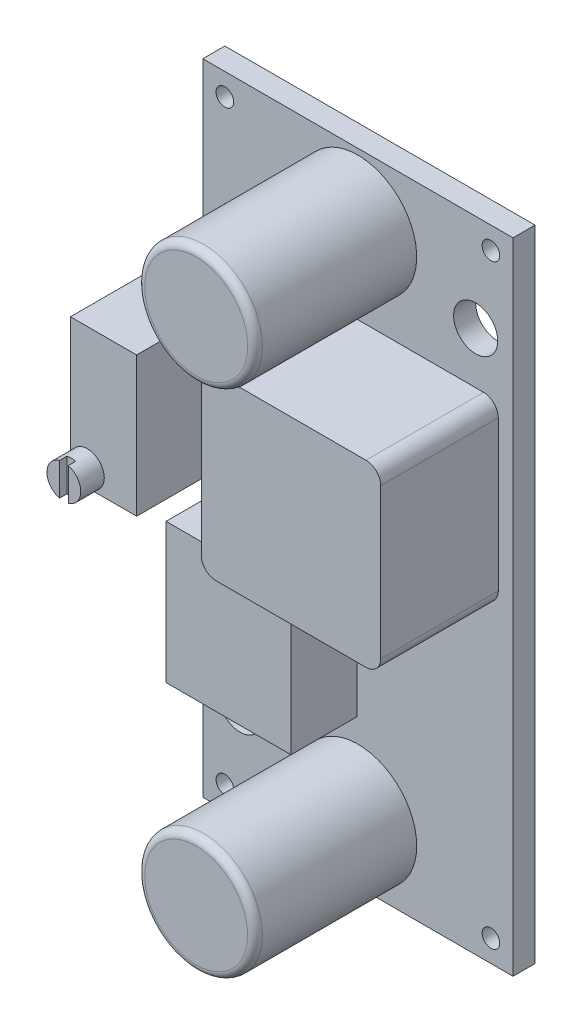
ISO-10303-21;
HEADER;
FILE_DESCRIPTION(('STEP AP214'),'2;1');
FILE_NAME('part.step','',(''),(''),'','','');
FILE_SCHEMA(('AUTOMOTIVE_DESIGN { 1 0 10303 214 1 1 1 1 }'));
ENDSEC;
DATA;
#1=APPLICATION_CONTEXT('core data for automotive mechanical design processes');
#2=APPLICATION_PROTOCOL_DEFINITION('international standard','automotive_design',2000,#1);
#3=PRODUCT_CONTEXT('',#1,'mechanical');
#4=PRODUCT('Part','Part','',(#3));
#5=PRODUCT_RELATED_PRODUCT_CATEGORY('part','',(#4));
#6=PRODUCT_DEFINITION_FORMATION('','',#4);
#7=PRODUCT_DEFINITION_CONTEXT('part definition',#1,'design');
#8=PRODUCT_DEFINITION('design','',#6,#7);
#9=PRODUCT_DEFINITION_SHAPE('','',#8);
#10=(LENGTH_UNIT() NAMED_UNIT(*) SI_UNIT(.MILLI.,.METRE.));
#11=(NAMED_UNIT(*) PLANE_ANGLE_UNIT() SI_UNIT($,.RADIAN.));
#12=(NAMED_UNIT(*) SI_UNIT($,.STERADIAN.) SOLID_ANGLE_UNIT());
#13=UNCERTAINTY_MEASURE_WITH_UNIT(LENGTH_MEASURE(1.E-05),#10,'distance_accuracy_value','');
#14=(GEOMETRIC_REPRESENTATION_CONTEXT(3) GLOBAL_UNCERTAINTY_ASSIGNED_CONTEXT((#13)) GLOBAL_UNIT_ASSIGNED_CONTEXT((#10,
#11,#12)) REPRESENTATION_CONTEXT('',''));
#15=CARTESIAN_POINT('',(0.,0.,0.));
#16=DIRECTION('',(0.,0.,1.));
#17=DIRECTION('',(1.,0.,0.));
#18=AXIS2_PLACEMENT_3D('',#15,#16,#17);
#19=CARTESIAN_POINT('',(-8.4,3.70000000000001,13.1));
#20=DIRECTION('',(0.,0.,-1.));
#21=DIRECTION('',(-1.,0.,0.));
#22=AXIS2_PLACEMENT_3D('',#19,#20,#21);
#23=PLANE('',#22);
#24=CARTESIAN_POINT('',(-8.4,3.70000000000001,13.1));
#25=DIRECTION('',(0.,0.,-1.));
#26=DIRECTION('',(-1.,0.,0.));
#27=AXIS2_PLACEMENT_3D('',#24,#25,#26);
#28=CIRCLE('',#27,1.15);
#29=CARTESIAN_POINT('',(-8.7,2.58981983444128,13.1));
#30=VERTEX_POINT('',#29);
#31=CARTESIAN_POINT('',(-8.7,4.81018016555873,13.1));
#32=VERTEX_POINT('',#31);
#33=EDGE_CURVE('E223',#30,#32,#28,.T.);
#34=ORIENTED_EDGE('',*,*,#33,.F.);
#35=DIRECTION('',(0.,1.,0.));
#36=VECTOR('',#35,1.);
#37=CARTESIAN_POINT('',(-8.7,3.70000000000001,13.1));
#38=LINE('',#37,#36);
#39=EDGE_CURVE('E210',#30,#32,#38,.T.);
#40=ORIENTED_EDGE('',*,*,#39,.T.);
#41=EDGE_LOOP('',(#34,#40));
#42=FACE_BOUND('',#41,.T.);
#43=ADVANCED_FACE('F37',(#42),#23,.F.);
#44=CARTESIAN_POINT('',(0.,0.,11.5));
#45=DIRECTION('',(0.,0.,-1.));
#46=DIRECTION('',(-1.,0.,0.));
#47=AXIS2_PLACEMENT_3D('',#44,#45,#46);
#48=PLANE('',#47);
#49=DIRECTION('',(0.,-1.,0.));
#50=VECTOR('',#49,1.);
#51=CARTESIAN_POINT('',(-9.55,12.05,11.5));
#52=LINE('',#51,#50);
#53=CARTESIAN_POINT('',(-9.55,12.05,11.5));
#54=VERTEX_POINT('',#53);
#55=CARTESIAN_POINT('',(-9.55,3.70000000000001,11.5));
#56=VERTEX_POINT('',#55);
#57=EDGE_CURVE('E246',#54,#56,#52,.T.);
#58=ORIENTED_EDGE('',*,*,#57,.T.);
#59=CARTESIAN_POINT('',(-8.4,3.70000000000001,11.5));
#60=DIRECTION('',(0.,0.,-1.));
#61=DIRECTION('',(-1.,0.,0.));
#62=AXIS2_PLACEMENT_3D('',#59,#60,#61);
#63=CIRCLE('',#62,1.15);
#64=CARTESIAN_POINT('',(-8.4,2.55000000000001,11.5));
#65=VERTEX_POINT('',#64);
#66=EDGE_CURVE('E59',#56,#65,#63,.T.);
#67=ORIENTED_EDGE('',*,*,#66,.T.);
#68=DIRECTION('',(1.,0.,0.));
#69=VECTOR('',#68,1.);
#70=CARTESIAN_POINT('',(-9.55,2.55000000000001,11.5));
#71=LINE('',#70,#69);
#72=CARTESIAN_POINT('',(-5.05,2.55000000000001,11.5));
#73=VERTEX_POINT('',#72);
#74=EDGE_CURVE('E241',#65,#73,#71,.T.);
#75=ORIENTED_EDGE('',*,*,#74,.T.);
#76=DIRECTION('',(0.,-1.,0.));
#77=VECTOR('',#76,1.);
#78=CARTESIAN_POINT('',(-5.05,12.05,11.5));
#79=LINE('',#78,#77);
#80=CARTESIAN_POINT('',(-5.05,12.05,11.5));
#81=VERTEX_POINT('',#80);
#82=EDGE_CURVE('E237',#81,#73,#79,.T.);
#83=ORIENTED_EDGE('',*,*,#82,.F.);
#84=DIRECTION('',(1.,0.,0.));
#85=VECTOR('',#84,1.);
#86=CARTESIAN_POINT('',(-9.55,12.05,11.5));
#87=LINE('',#86,#85);
#88=EDGE_CURVE('E234',#54,#81,#87,.T.);
#89=ORIENTED_EDGE('',*,*,#88,.F.);
#90=EDGE_LOOP('',(#58,#67,#75,#83,#89));
#91=FACE_BOUND('',#90,.T.);
#92=ADVANCED_FACE('F463',(#91),#48,.F.);
#93=CARTESIAN_POINT('',(10.55,-21.75,1.5));
#94=DIRECTION('',(-1.,0.,0.));
#95=DIRECTION('',(0.,0.,1.));
#96=AXIS2_PLACEMENT_3D('',#93,#94,#95);
#97=PLANE('',#96);
#98=DIRECTION('',(0.,1.,0.));
#99=VECTOR('',#98,1.);
#100=CARTESIAN_POINT('',(10.55,-21.75,0.));
#101=LINE('',#100,#99);
#102=CARTESIAN_POINT('',(10.55,-21.75,0.));
#103=VERTEX_POINT('',#102);
#104=CARTESIAN_POINT('',(10.55,21.75,0.));
#105=VERTEX_POINT('',#104);
#106=EDGE_CURVE('E396',#103,#105,#101,.T.);
#107=ORIENTED_EDGE('',*,*,#106,.T.);
#108=DIRECTION('',(0.,0.,-1.));
#109=VECTOR('',#108,1.);
#110=CARTESIAN_POINT('',(10.55,21.75,1.5));
#111=LINE('',#110,#109);
#112=CARTESIAN_POINT('',(10.55,21.75,1.5));
#113=VERTEX_POINT('',#112);
#114=EDGE_CURVE('E423',#113,#105,#111,.T.);
#115=ORIENTED_EDGE('',*,*,#114,.F.);
#116=DIRECTION('',(0.,1.,0.));
#117=VECTOR('',#116,1.);
#118=CARTESIAN_POINT('',(10.55,-21.75,1.5));
#119=LINE('',#118,#117);
#120=CARTESIAN_POINT('',(10.55,-21.75,1.5));
#121=VERTEX_POINT('',#120);
#122=EDGE_CURVE('E397',#121,#113,#119,.T.);
#123=ORIENTED_EDGE('',*,*,#122,.F.);
#124=DIRECTION('',(0.,0.,-1.));
#125=VECTOR('',#124,1.);
#126=CARTESIAN_POINT('',(10.55,-21.75,1.5));
#127=LINE('',#126,#125);
#128=EDGE_CURVE('E407',#121,#103,#127,.T.);
#129=ORIENTED_EDGE('',*,*,#128,.T.);
#130=EDGE_LOOP('',(#107,#115,#123,#129));
#131=FACE_BOUND('',#130,.T.);
#132=ADVANCED_FACE('F467',(#131),#97,.F.);
#133=CARTESIAN_POINT('',(-10.55,21.75,1.5));
#134=DIRECTION('',(0.,-1.,0.));
#135=DIRECTION('',(0.,0.,-1.));
#136=AXIS2_PLACEMENT_3D('',#133,#134,#135);
#137=PLANE('',#136);
#138=DIRECTION('',(-1.,0.,0.));
#139=VECTOR('',#138,1.);
#140=CARTESIAN_POINT('',(-10.55,21.75,0.));
#141=LINE('',#140,#139);
#142=CARTESIAN_POINT('',(-10.55,21.75,0.));
#143=VERTEX_POINT('',#142);
#144=EDGE_CURVE('E410',#105,#143,#141,.T.);
#145=ORIENTED_EDGE('',*,*,#144,.T.);
#146=DIRECTION('',(0.,0.,-1.));
#147=VECTOR('',#146,1.);
#148=CARTESIAN_POINT('',(-10.55,21.75,1.5));
#149=LINE('',#148,#147);
#150=CARTESIAN_POINT('',(-10.55,21.75,1.5));
#151=VERTEX_POINT('',#150);
#152=EDGE_CURVE('E420',#151,#143,#149,.T.);
#153=ORIENTED_EDGE('',*,*,#152,.F.);
#154=DIRECTION('',(-1.,0.,0.));
#155=VECTOR('',#154,1.);
#156=CARTESIAN_POINT('',(-10.55,21.75,1.5));
#157=LINE('',#156,#155);
#158=EDGE_CURVE('E400',#113,#151,#157,.T.);
#159=ORIENTED_EDGE('',*,*,#158,.F.);
#160=ORIENTED_EDGE('',*,*,#114,.T.);
#161=EDGE_LOOP('',(#145,#153,#159,#160));
#162=FACE_BOUND('',#161,.T.);
#163=ADVANCED_FACE('F604',(#162),#137,.F.);
#164=CARTESIAN_POINT('',(-10.55,-21.75,1.5));
#165=DIRECTION('',(1.,0.,0.));
#166=DIRECTION('',(0.,0.,-1.));
#167=AXIS2_PLACEMENT_3D('',#164,#165,#166);
#168=PLANE('',#167);
#169=DIRECTION('',(0.,-1.,0.));
#170=VECTOR('',#169,1.);
#171=CARTESIAN_POINT('',(-10.55,-21.75,0.));
#172=LINE('',#171,#170);
#173=CARTESIAN_POINT('',(-10.55,-21.75,0.));
#174=VERTEX_POINT('',#173);
#175=EDGE_CURVE('E412',#143,#174,#172,.T.);
#176=ORIENTED_EDGE('',*,*,#175,.T.);
#177=DIRECTION('',(0.,0.,-1.));
#178=VECTOR('',#177,1.);
#179=CARTESIAN_POINT('',(-10.55,-21.75,1.5));
#180=LINE('',#179,#178);
#181=CARTESIAN_POINT('',(-10.55,-21.75,1.5));
#182=VERTEX_POINT('',#181);
#183=EDGE_CURVE('E417',#182,#174,#180,.T.);
#184=ORIENTED_EDGE('',*,*,#183,.F.);
#185=DIRECTION('',(0.,-1.,0.));
#186=VECTOR('',#185,1.);
#187=CARTESIAN_POINT('',(-10.55,-21.75,1.5));
#188=LINE('',#187,#186);
#189=EDGE_CURVE('E403',#151,#182,#188,.T.);
#190=ORIENTED_EDGE('',*,*,#189,.F.);
#191=ORIENTED_EDGE('',*,*,#152,.T.);
#192=EDGE_LOOP('',(#176,#184,#190,#191));
#193=FACE_BOUND('',#192,.T.);
#194=ADVANCED_FACE('F600',(#193),#168,.F.);
#195=CARTESIAN_POINT('',(-10.55,-21.75,1.5));
#196=DIRECTION('',(0.,1.,0.));
#197=DIRECTION('',(0.,0.,1.));
#198=AXIS2_PLACEMENT_3D('',#195,#196,#197);
#199=PLANE('',#198);
#200=DIRECTION('',(1.,0.,0.));
#201=VECTOR('',#200,1.);
#202=CARTESIAN_POINT('',(-10.55,-21.75,0.));
#203=LINE('',#202,#201);
#204=EDGE_CURVE('E401',#174,#103,#203,.T.);
#205=ORIENTED_EDGE('',*,*,#204,.T.);
#206=ORIENTED_EDGE('',*,*,#128,.F.);
#207=DIRECTION('',(1.,0.,0.));
#208=VECTOR('',#207,1.);
#209=CARTESIAN_POINT('',(-10.55,-21.75,1.5));
#210=LINE('',#209,#208);
#211=EDGE_CURVE('E405',#182,#121,#210,.T.);
#212=ORIENTED_EDGE('',*,*,#211,.F.);
#213=ORIENTED_EDGE('',*,*,#183,.T.);
#214=EDGE_LOOP('',(#205,#206,#212,#213));
#215=FACE_BOUND('',#214,.T.);
#216=ADVANCED_FACE('F593',(#215),#199,.F.);
#217=CARTESIAN_POINT('',(0.,0.,1.5));
#218=DIRECTION('',(0.,0.,-1.));
#219=DIRECTION('',(-1.,0.,0.));
#220=AXIS2_PLACEMENT_3D('',#217,#218,#219);
#221=PLANE('',#220);
#222=DIRECTION('',(0.,-1.,0.));
#223=VECTOR('',#222,1.);
#224=CARTESIAN_POINT('',(-9.55,12.05,1.5));
#225=LINE('',#224,#223);
#226=CARTESIAN_POINT('',(-9.55,12.05,1.5));
#227=VERTEX_POINT('',#226);
#228=CARTESIAN_POINT('',(-9.55,2.55000000000001,1.5));
#229=VERTEX_POINT('',#228);
#230=EDGE_CURVE('E238',#227,#229,#225,.T.);
#231=ORIENTED_EDGE('',*,*,#230,.F.);
#232=DIRECTION('',(1.,0.,0.));
#233=VECTOR('',#232,1.);
#234=CARTESIAN_POINT('',(-9.55,12.05,1.5));
#235=LINE('',#234,#233);
#236=CARTESIAN_POINT('',(-5.05,12.05,1.5));
#237=VERTEX_POINT('',#236);
#238=EDGE_CURVE('E222',#227,#237,#235,.T.);
#239=ORIENTED_EDGE('',*,*,#238,.T.);
#240=DIRECTION('',(0.,-1.,0.));
#241=VECTOR('',#240,1.);
#242=CARTESIAN_POINT('',(-5.05,12.05,1.5));
#243=LINE('',#242,#241);
#244=CARTESIAN_POINT('',(-5.05,2.55000000000001,1.5));
#245=VERTEX_POINT('',#244);
#246=EDGE_CURVE('E226',#237,#245,#243,.T.);
#247=ORIENTED_EDGE('',*,*,#246,.T.);
#248=DIRECTION('',(1.,0.,0.));
#249=VECTOR('',#248,1.);
#250=CARTESIAN_POINT('',(-9.55,2.55000000000001,1.5));
#251=LINE('',#250,#249);
#252=EDGE_CURVE('E252',#229,#245,#251,.T.);
#253=ORIENTED_EDGE('',*,*,#252,.F.);
#254=EDGE_LOOP('',(#231,#239,#247,#253));
#255=FACE_BOUND('',#254,.T.);
#256=DIRECTION('',(1.,0.,0.));
#257=VECTOR('',#256,1.);
#258=CARTESIAN_POINT('',(0.,-2.25,1.5));
#259=LINE('',#258,#257);
#260=CARTESIAN_POINT('',(-8.55,-2.25,1.5));
#261=VERTEX_POINT('',#260);
#262=CARTESIAN_POINT('',(-0.0499999999999997,-2.25,1.5));
#263=VERTEX_POINT('',#262);
#264=EDGE_CURVE('E278',#261,#263,#259,.T.);
#265=ORIENTED_EDGE('',*,*,#264,.T.);
#266=DIRECTION('',(0.,-1.,0.));
#267=VECTOR('',#266,1.);
#268=CARTESIAN_POINT('',(-0.0500000000000001,0.,1.5));
#269=LINE('',#268,#267);
#270=CARTESIAN_POINT('',(-0.049999999999998,-11.75,1.5));
#271=VERTEX_POINT('',#270);
#272=EDGE_CURVE('E257',#263,#271,#269,.T.);
#273=ORIENTED_EDGE('',*,*,#272,.T.);
#274=DIRECTION('',(1.,0.,0.));
#275=VECTOR('',#274,1.);
#276=CARTESIAN_POINT('',(0.,-11.75,1.5));
#277=LINE('',#276,#275);
#278=CARTESIAN_POINT('',(-8.55,-11.75,1.5));
#279=VERTEX_POINT('',#278);
#280=EDGE_CURVE('E269',#279,#271,#277,.T.);
#281=ORIENTED_EDGE('',*,*,#280,.F.);
#282=DIRECTION('',(0.,-1.,0.));
#283=VECTOR('',#282,1.);
#284=CARTESIAN_POINT('',(-8.55,0.,1.5));
#285=LINE('',#284,#283);
#286=EDGE_CURVE('E280',#261,#279,#285,.T.);
#287=ORIENTED_EDGE('',*,*,#286,.F.);
#288=EDGE_LOOP('',(#265,#273,#281,#287));
#289=FACE_BOUND('',#288,.T.);
#290=DIRECTION('',(-1.,0.,0.));
#291=VECTOR('',#290,1.);
#292=CARTESIAN_POINT('',(0.,11.65,1.5));
#293=LINE('',#292,#291);
#294=CARTESIAN_POINT('',(8.55,11.65,1.5));
#295=VERTEX_POINT('',#294);
#296=CARTESIAN_POINT('',(-1.65,11.65,1.5));
#297=VERTEX_POINT('',#296);
#298=EDGE_CURVE('E321',#295,#297,#293,.T.);
#299=ORIENTED_EDGE('',*,*,#298,.F.);
#300=CARTESIAN_POINT('',(8.55,10.65,1.5));
#301=DIRECTION('',(0.,0.,1.));
#302=DIRECTION('',(1.,0.,0.));
#303=AXIS2_PLACEMENT_3D('',#300,#301,#302);
#304=CIRCLE('',#303,1.);
#305=CARTESIAN_POINT('',(9.55,10.65,1.5));
#306=VERTEX_POINT('',#305);
#307=EDGE_CURVE('E296',#295,#306,#304,.F.);
#308=ORIENTED_EDGE('',*,*,#307,.T.);
#309=DIRECTION('',(0.,-1.,0.));
#310=VECTOR('',#309,1.);
#311=CARTESIAN_POINT('',(9.55,0.,1.5));
#312=LINE('',#311,#310);
#313=CARTESIAN_POINT('',(9.55,0.45,1.5));
#314=VERTEX_POINT('',#313);
#315=EDGE_CURVE('E301',#306,#314,#312,.T.);
#316=ORIENTED_EDGE('',*,*,#315,.T.);
#317=CARTESIAN_POINT('',(8.55,0.45,1.5));
#318=DIRECTION('',(0.,0.,1.));
#319=DIRECTION('',(1.,0.,0.));
#320=AXIS2_PLACEMENT_3D('',#317,#318,#319);
#321=CIRCLE('',#320,1.);
#322=CARTESIAN_POINT('',(8.55,-0.55,1.5));
#323=VERTEX_POINT('',#322);
#324=EDGE_CURVE('E333',#314,#323,#321,.F.);
#325=ORIENTED_EDGE('',*,*,#324,.T.);
#326=DIRECTION('',(-1.,0.,0.));
#327=VECTOR('',#326,1.);
#328=CARTESIAN_POINT('',(0.,-0.550000000000001,1.5));
#329=LINE('',#328,#327);
#330=CARTESIAN_POINT('',(-1.65,-0.550000000000001,1.5));
#331=VERTEX_POINT('',#330);
#332=EDGE_CURVE('E330',#323,#331,#329,.T.);
#333=ORIENTED_EDGE('',*,*,#332,.T.);
#334=CARTESIAN_POINT('',(-1.65,0.449999999999999,1.5));
#335=DIRECTION('',(0.,0.,1.));
#336=DIRECTION('',(1.,0.,0.));
#337=AXIS2_PLACEMENT_3D('',#334,#335,#336);
#338=CIRCLE('',#337,1.);
#339=CARTESIAN_POINT('',(-2.65,0.449999999999999,1.5));
#340=VERTEX_POINT('',#339);
#341=EDGE_CURVE('E327',#340,#331,#338,.T.);
#342=ORIENTED_EDGE('',*,*,#341,.F.);
#343=DIRECTION('',(0.,-1.,0.));
#344=VECTOR('',#343,1.);
#345=CARTESIAN_POINT('',(-2.65,0.,1.5));
#346=LINE('',#345,#344);
#347=CARTESIAN_POINT('',(-2.65,10.65,1.5));
#348=VERTEX_POINT('',#347);
#349=EDGE_CURVE('E325',#348,#340,#346,.T.);
#350=ORIENTED_EDGE('',*,*,#349,.F.);
#351=CARTESIAN_POINT('',(-1.65,10.65,1.5));
#352=DIRECTION('',(0.,0.,1.));
#353=DIRECTION('',(1.,0.,0.));
#354=AXIS2_PLACEMENT_3D('',#351,#352,#353);
#355=CIRCLE('',#354,1.);
#356=EDGE_CURVE('E323',#297,#348,#355,.T.);
#357=ORIENTED_EDGE('',*,*,#356,.F.);
#358=EDGE_LOOP('',(#299,#308,#316,#325,#333,#342,#350,#357));
#359=FACE_BOUND('',#358,.T.);
#360=CARTESIAN_POINT('',(0.,-17.35,1.5));
#361=DIRECTION('',(0.,0.,1.));
#362=DIRECTION('',(1.,0.,0.));
#363=AXIS2_PLACEMENT_3D('',#360,#361,#362);
#364=CIRCLE('',#363,4.);
#365=CARTESIAN_POINT('',(4.,-17.35,1.5));
#366=VERTEX_POINT('',#365);
#367=EDGE_CURVE('E357',#366,#366,#364,.F.);
#368=ORIENTED_EDGE('',*,*,#367,.T.);
#369=EDGE_LOOP('',(#368));
#370=FACE_BOUND('',#369,.T.);
#371=CARTESIAN_POINT('',(0.,17.35,1.5));
#372=DIRECTION('',(0.,0.,-1.));
#373=DIRECTION('',(-1.,0.,0.));
#374=AXIS2_PLACEMENT_3D('',#371,#372,#373);
#375=CIRCLE('',#374,4.);
#376=CARTESIAN_POINT('',(-4.,17.35,1.5));
#377=VERTEX_POINT('',#376);
#378=EDGE_CURVE('E426',#377,#377,#375,.F.);
#379=ORIENTED_EDGE('',*,*,#378,.F.);
#380=EDGE_LOOP('',(#379));
#381=FACE_BOUND('',#380,.T.);
#382=CARTESIAN_POINT('',(9.05,-20.25,1.5));
#383=DIRECTION('',(0.,0.,1.));
#384=DIRECTION('',(-1.,0.,0.));
#385=AXIS2_PLACEMENT_3D('',#382,#383,#384);
#386=CIRCLE('',#385,0.6);
#387=CARTESIAN_POINT('',(8.45,-20.25,1.5));
#388=VERTEX_POINT('',#387);
#389=EDGE_CURVE('E366',#388,#388,#386,.T.);
#390=ORIENTED_EDGE('',*,*,#389,.F.);
#391=EDGE_LOOP('',(#390));
#392=FACE_BOUND('',#391,.T.);
#393=CARTESIAN_POINT('',(-9.05,20.25,1.5));
#394=DIRECTION('',(0.,0.,1.));
#395=DIRECTION('',(-1.,0.,0.));
#396=AXIS2_PLACEMENT_3D('',#393,#394,#395);
#397=CIRCLE('',#396,0.6);
#398=CARTESIAN_POINT('',(-9.65,20.25,1.5));
#399=VERTEX_POINT('',#398);
#400=EDGE_CURVE('E367',#399,#399,#397,.T.);
#401=ORIENTED_EDGE('',*,*,#400,.F.);
#402=EDGE_LOOP('',(#401));
#403=FACE_BOUND('',#402,.T.);
#404=CARTESIAN_POINT('',(9.05,20.25,1.5));
#405=DIRECTION('',(0.,0.,1.));
#406=DIRECTION('',(1.,0.,0.));
#407=AXIS2_PLACEMENT_3D('',#404,#405,#406);
#408=CIRCLE('',#407,0.6);
#409=CARTESIAN_POINT('',(9.65,20.25,1.5));
#410=VERTEX_POINT('',#409);
#411=EDGE_CURVE('E374',#410,#410,#408,.T.);
#412=ORIENTED_EDGE('',*,*,#411,.F.);
#413=EDGE_LOOP('',(#412));
#414=FACE_BOUND('',#413,.T.);
#415=CARTESIAN_POINT('',(-8.01,-15.15,1.5));
#416=DIRECTION('',(0.,0.,1.));
#417=DIRECTION('',(1.,0.,0.));
#418=AXIS2_PLACEMENT_3D('',#415,#416,#417);
#419=CIRCLE('',#418,1.5);
#420=CARTESIAN_POINT('',(-6.51,-15.15,1.5));
#421=VERTEX_POINT('',#420);
#422=EDGE_CURVE('E379',#421,#421,#419,.T.);
#423=ORIENTED_EDGE('',*,*,#422,.F.);
#424=EDGE_LOOP('',(#423));
#425=FACE_BOUND('',#424,.T.);
#426=CARTESIAN_POINT('',(-9.05,-20.25,1.5));
#427=DIRECTION('',(0.,0.,1.));
#428=DIRECTION('',(1.,0.,0.));
#429=AXIS2_PLACEMENT_3D('',#426,#427,#428);
#430=CIRCLE('',#429,0.6);
#431=CARTESIAN_POINT('',(-8.45,-20.25,1.5));
#432=VERTEX_POINT('',#431);
#433=EDGE_CURVE('E360',#432,#432,#430,.T.);
#434=ORIENTED_EDGE('',*,*,#433,.F.);
#435=EDGE_LOOP('',(#434));
#436=FACE_BOUND('',#435,.T.);
#437=CARTESIAN_POINT('',(8.01,15.15,1.5));
#438=DIRECTION('',(0.,0.,1.));
#439=DIRECTION('',(1.,0.,0.));
#440=AXIS2_PLACEMENT_3D('',#437,#438,#439);
#441=CIRCLE('',#440,1.5);
#442=CARTESIAN_POINT('',(9.51,15.15,1.5));
#443=VERTEX_POINT('',#442);
#444=EDGE_CURVE('E386',#443,#443,#441,.T.);
#445=ORIENTED_EDGE('',*,*,#444,.F.);
#446=EDGE_LOOP('',(#445));
#447=FACE_BOUND('',#446,.T.);
#448=ORIENTED_EDGE('',*,*,#122,.T.);
#449=ORIENTED_EDGE('',*,*,#158,.T.);
#450=ORIENTED_EDGE('',*,*,#189,.T.);
#451=ORIENTED_EDGE('',*,*,#211,.T.);
#452=EDGE_LOOP('',(#448,#449,#450,#451));
#453=FACE_BOUND('',#452,.T.);
#454=ADVANCED_FACE('F590',(#255,#289,#359,#370,#381,#392,#403,#414,#425,#436,#447,#453),#221,.F.);
#455=CARTESIAN_POINT('',(0.,0.,0.));
#456=DIRECTION('',(0.,0.,-1.));
#457=DIRECTION('',(-1.,0.,0.));
#458=AXIS2_PLACEMENT_3D('',#455,#456,#457);
#459=PLANE('',#458);
#460=CARTESIAN_POINT('',(9.05,-20.25,0.));
#461=DIRECTION('',(0.,0.,-1.));
#462=DIRECTION('',(-1.,0.,0.));
#463=AXIS2_PLACEMENT_3D('',#460,#461,#462);
#464=CIRCLE('',#463,0.6);
#465=CARTESIAN_POINT('',(8.45,-20.25,0.));
#466=VERTEX_POINT('',#465);
#467=EDGE_CURVE('E371',#466,#466,#464,.F.);
#468=ORIENTED_EDGE('',*,*,#467,.T.);
#469=EDGE_LOOP('',(#468));
#470=FACE_BOUND('',#469,.T.);
#471=CARTESIAN_POINT('',(-9.05,20.25,0.));
#472=DIRECTION('',(0.,0.,-1.));
#473=DIRECTION('',(-1.,0.,0.));
#474=AXIS2_PLACEMENT_3D('',#471,#472,#473);
#475=CIRCLE('',#474,0.6);
#476=CARTESIAN_POINT('',(-9.65,20.25,0.));
#477=VERTEX_POINT('',#476);
#478=EDGE_CURVE('E370',#477,#477,#475,.F.);
#479=ORIENTED_EDGE('',*,*,#478,.T.);
#480=EDGE_LOOP('',(#479));
#481=FACE_BOUND('',#480,.T.);
#482=CARTESIAN_POINT('',(9.05,20.25,0.));
#483=DIRECTION('',(0.,0.,-1.));
#484=DIRECTION('',(-1.,0.,0.));
#485=AXIS2_PLACEMENT_3D('',#482,#483,#484);
#486=CIRCLE('',#485,0.6);
#487=CARTESIAN_POINT('',(8.45,20.25,0.));
#488=VERTEX_POINT('',#487);
#489=EDGE_CURVE('E383',#488,#488,#486,.F.);
#490=ORIENTED_EDGE('',*,*,#489,.T.);
#491=EDGE_LOOP('',(#490));
#492=FACE_BOUND('',#491,.T.);
#493=CARTESIAN_POINT('',(-8.01,-15.15,0.));
#494=DIRECTION('',(0.,0.,-1.));
#495=DIRECTION('',(-1.,0.,0.));
#496=AXIS2_PLACEMENT_3D('',#493,#494,#495);
#497=CIRCLE('',#496,1.5);
#498=CARTESIAN_POINT('',(-9.51,-15.15,0.));
#499=VERTEX_POINT('',#498);
#500=EDGE_CURVE('E382',#499,#499,#497,.F.);
#501=ORIENTED_EDGE('',*,*,#500,.T.);
#502=EDGE_LOOP('',(#501));
#503=FACE_BOUND('',#502,.T.);
#504=CARTESIAN_POINT('',(-9.05,-20.25,0.));
#505=DIRECTION('',(0.,0.,-1.));
#506=DIRECTION('',(-1.,0.,0.));
#507=AXIS2_PLACEMENT_3D('',#504,#505,#506);
#508=CIRCLE('',#507,0.6);
#509=CARTESIAN_POINT('',(-9.65,-20.25,0.));
#510=VERTEX_POINT('',#509);
#511=EDGE_CURVE('E363',#510,#510,#508,.F.);
#512=ORIENTED_EDGE('',*,*,#511,.T.);
#513=EDGE_LOOP('',(#512));
#514=FACE_BOUND('',#513,.T.);
#515=CARTESIAN_POINT('',(8.01,15.15,0.));
#516=DIRECTION('',(0.,0.,-1.));
#517=DIRECTION('',(-1.,0.,0.));
#518=AXIS2_PLACEMENT_3D('',#515,#516,#517);
#519=CIRCLE('',#518,1.5);
#520=CARTESIAN_POINT('',(6.51,15.15,0.));
#521=VERTEX_POINT('',#520);
#522=EDGE_CURVE('E393',#521,#521,#519,.F.);
#523=ORIENTED_EDGE('',*,*,#522,.T.);
#524=EDGE_LOOP('',(#523));
#525=FACE_BOUND('',#524,.T.);
#526=ORIENTED_EDGE('',*,*,#106,.F.);
#527=ORIENTED_EDGE('',*,*,#204,.F.);
#528=ORIENTED_EDGE('',*,*,#175,.F.);
#529=ORIENTED_EDGE('',*,*,#144,.F.);
#530=EDGE_LOOP('',(#526,#527,#528,#529));
#531=FACE_BOUND('',#530,.T.);
#532=ADVANCED_FACE('F588',(#470,#481,#492,#503,#514,#525,#531),#459,.T.);
#533=CARTESIAN_POINT('',(8.01,15.15,-4.24264068711929));
#534=DIRECTION('',(0.,0.,1.));
#535=DIRECTION('',(1.,0.,0.));
#536=AXIS2_PLACEMENT_3D('',#533,#534,#535);
#537=CYLINDRICAL_SURFACE('',#536,1.5);
#538=ORIENTED_EDGE('',*,*,#444,.T.);
#539=EDGE_LOOP('',(#538));
#540=FACE_BOUND('',#539,.T.);
#541=ORIENTED_EDGE('',*,*,#522,.F.);
#542=EDGE_LOOP('',(#541));
#543=FACE_BOUND('',#542,.T.);
#544=ADVANCED_FACE('F570',(#540,#543),#537,.F.);
#545=CARTESIAN_POINT('',(-9.05,-20.25,-4.24264068711929));
#546=DIRECTION('',(0.,0.,1.));
#547=DIRECTION('',(1.,0.,0.));
#548=AXIS2_PLACEMENT_3D('',#545,#546,#547);
#549=CYLINDRICAL_SURFACE('',#548,0.6);
#550=ORIENTED_EDGE('',*,*,#433,.T.);
#551=EDGE_LOOP('',(#550));
#552=FACE_BOUND('',#551,.T.);
#553=ORIENTED_EDGE('',*,*,#511,.F.);
#554=EDGE_LOOP('',(#553));
#555=FACE_BOUND('',#554,.T.);
#556=ADVANCED_FACE('F566',(#552,#555),#549,.F.);
#557=CARTESIAN_POINT('',(-8.01,-15.15,-4.24264068711929));
#558=DIRECTION('',(0.,0.,1.));
#559=DIRECTION('',(1.,0.,0.));
#560=AXIS2_PLACEMENT_3D('',#557,#558,#559);
#561=CYLINDRICAL_SURFACE('',#560,1.5);
#562=ORIENTED_EDGE('',*,*,#422,.T.);
#563=EDGE_LOOP('',(#562));
#564=FACE_BOUND('',#563,.T.);
#565=ORIENTED_EDGE('',*,*,#500,.F.);
#566=EDGE_LOOP('',(#565));
#567=FACE_BOUND('',#566,.T.);
#568=ADVANCED_FACE('F569',(#564,#567),#561,.F.);
#569=CARTESIAN_POINT('',(9.05,20.25,-4.24264068711929));
#570=DIRECTION('',(0.,0.,1.));
#571=DIRECTION('',(1.,0.,0.));
#572=AXIS2_PLACEMENT_3D('',#569,#570,#571);
#573=CYLINDRICAL_SURFACE('',#572,0.6);
#574=ORIENTED_EDGE('',*,*,#411,.T.);
#575=EDGE_LOOP('',(#574));
#576=FACE_BOUND('',#575,.T.);
#577=ORIENTED_EDGE('',*,*,#489,.F.);
#578=EDGE_LOOP('',(#577));
#579=FACE_BOUND('',#578,.T.);
#580=ADVANCED_FACE('F575',(#576,#579),#573,.F.);
#581=CARTESIAN_POINT('',(-9.05,20.25,-4.24264068711929));
#582=DIRECTION('',(0.,0.,1.));
#583=DIRECTION('',(1.,0.,0.));
#584=AXIS2_PLACEMENT_3D('',#581,#582,#583);
#585=CYLINDRICAL_SURFACE('',#584,0.6);
#586=ORIENTED_EDGE('',*,*,#400,.T.);
#587=EDGE_LOOP('',(#586));
#588=FACE_BOUND('',#587,.T.);
#589=ORIENTED_EDGE('',*,*,#478,.F.);
#590=EDGE_LOOP('',(#589));
#591=FACE_BOUND('',#590,.T.);
#592=ADVANCED_FACE('F572',(#588,#591),#585,.F.);
#593=CARTESIAN_POINT('',(9.05,-20.25,-4.24264068711929));
#594=DIRECTION('',(0.,0.,1.));
#595=DIRECTION('',(1.,0.,0.));
#596=AXIS2_PLACEMENT_3D('',#593,#594,#595);
#597=CYLINDRICAL_SURFACE('',#596,0.6);
#598=ORIENTED_EDGE('',*,*,#389,.T.);
#599=EDGE_LOOP('',(#598));
#600=FACE_BOUND('',#599,.T.);
#601=ORIENTED_EDGE('',*,*,#467,.F.);
#602=EDGE_LOOP('',(#601));
#603=FACE_BOUND('',#602,.T.);
#604=ADVANCED_FACE('F564',(#600,#603),#597,.F.);
#605=CARTESIAN_POINT('',(0.,17.35,12.5));
#606=DIRECTION('',(0.,0.,-1.));
#607=DIRECTION('',(-1.,0.,0.));
#608=AXIS2_PLACEMENT_3D('',#605,#606,#607);
#609=CYLINDRICAL_SURFACE('',#608,4.);
#610=CARTESIAN_POINT('',(0.,17.35,12.));
#611=DIRECTION('',(0.,0.,1.));
#612=DIRECTION('',(1.,0.,0.));
#613=AXIS2_PLACEMENT_3D('',#610,#611,#612);
#614=CIRCLE('',#613,4.);
#615=CARTESIAN_POINT('',(4.,17.35,12.));
#616=VERTEX_POINT('',#615);
#617=EDGE_CURVE('E438',#616,#616,#614,.F.);
#618=ORIENTED_EDGE('',*,*,#617,.T.);
#619=EDGE_LOOP('',(#618));
#620=FACE_BOUND('',#619,.T.);
#621=ORIENTED_EDGE('',*,*,#378,.T.);
#622=EDGE_LOOP('',(#621));
#623=FACE_BOUND('',#622,.T.);
#624=ADVANCED_FACE('F560',(#620,#623),#609,.T.);
#625=CARTESIAN_POINT('',(0.,0.,12.5));
#626=DIRECTION('',(0.,0.,1.));
#627=DIRECTION('',(1.,0.,0.));
#628=AXIS2_PLACEMENT_3D('',#625,#626,#627);
#629=PLANE('',#628);
#630=CARTESIAN_POINT('',(0.,17.35,12.5));
#631=DIRECTION('',(0.,0.,1.));
#632=DIRECTION('',(1.,0.,0.));
#633=AXIS2_PLACEMENT_3D('',#630,#631,#632);
#634=CIRCLE('',#633,3.5);
#635=CARTESIAN_POINT('',(3.5,17.35,12.5));
#636=VERTEX_POINT('',#635);
#637=EDGE_CURVE('E435',#636,#636,#634,.T.);
#638=ORIENTED_EDGE('',*,*,#637,.T.);
#639=EDGE_LOOP('',(#638));
#640=FACE_BOUND('',#639,.T.);
#641=ADVANCED_FACE('F556',(#640),#629,.T.);
#642=CARTESIAN_POINT('',(0.,-17.35,12.5));
#643=DIRECTION('',(0.,0.,-1.));
#644=DIRECTION('',(-1.,0.,0.));
#645=AXIS2_PLACEMENT_3D('',#642,#643,#644);
#646=CYLINDRICAL_SURFACE('',#645,4.);
#647=CARTESIAN_POINT('',(0.,-17.35,12.));
#648=DIRECTION('',(0.,0.,1.));
#649=DIRECTION('',(1.,0.,0.));
#650=AXIS2_PLACEMENT_3D('',#647,#648,#649);
#651=CIRCLE('',#650,4.);
#652=CARTESIAN_POINT('',(4.,-17.35,12.));
#653=VERTEX_POINT('',#652);
#654=EDGE_CURVE('E429',#653,#653,#651,.F.);
#655=ORIENTED_EDGE('',*,*,#654,.T.);
#656=EDGE_LOOP('',(#655));
#657=FACE_BOUND('',#656,.T.);
#658=ORIENTED_EDGE('',*,*,#367,.F.);
#659=EDGE_LOOP('',(#658));
#660=FACE_BOUND('',#659,.T.);
#661=ADVANCED_FACE('F552',(#657,#660),#646,.T.);
#662=CARTESIAN_POINT('',(0.,0.,12.5));
#663=DIRECTION('',(0.,0.,1.));
#664=DIRECTION('',(1.,0.,0.));
#665=AXIS2_PLACEMENT_3D('',#662,#663,#664);
#666=PLANE('',#665);
#667=CARTESIAN_POINT('',(0.,-17.35,12.5));
#668=DIRECTION('',(0.,0.,1.));
#669=DIRECTION('',(1.,0.,0.));
#670=AXIS2_PLACEMENT_3D('',#667,#668,#669);
#671=CIRCLE('',#670,3.5);
#672=CARTESIAN_POINT('',(3.5,-17.35,12.5));
#673=VERTEX_POINT('',#672);
#674=EDGE_CURVE('E432',#673,#673,#671,.T.);
#675=ORIENTED_EDGE('',*,*,#674,.T.);
#676=EDGE_LOOP('',(#675));
#677=FACE_BOUND('',#676,.T.);
#678=ADVANCED_FACE('F548',(#677),#666,.T.);
#679=CARTESIAN_POINT('',(8.55,10.65,9.5));
#680=DIRECTION('',(0.,0.,-1.));
#681=DIRECTION('',(-1.,0.,0.));
#682=AXIS2_PLACEMENT_3D('',#679,#680,#681);
#683=CYLINDRICAL_SURFACE('',#682,1.);
#684=ORIENTED_EDGE('',*,*,#307,.F.);
#685=DIRECTION('',(0.,0.,-1.));
#686=VECTOR('',#685,1.);
#687=CARTESIAN_POINT('',(8.55,11.65,9.5));
#688=LINE('',#687,#686);
#689=CARTESIAN_POINT('',(8.55,11.65,9.5));
#690=VERTEX_POINT('',#689);
#691=EDGE_CURVE('E355',#690,#295,#688,.T.);
#692=ORIENTED_EDGE('',*,*,#691,.F.);
#693=CARTESIAN_POINT('',(8.55,10.65,9.5));
#694=DIRECTION('',(0.,0.,1.));
#695=DIRECTION('',(1.,0.,0.));
#696=AXIS2_PLACEMENT_3D('',#693,#694,#695);
#697=CIRCLE('',#696,1.);
#698=CARTESIAN_POINT('',(9.55,10.65,9.5));
#699=VERTEX_POINT('',#698);
#700=EDGE_CURVE('E297',#690,#699,#697,.F.);
#701=ORIENTED_EDGE('',*,*,#700,.T.);
#702=DIRECTION('',(0.,0.,-1.));
#703=VECTOR('',#702,1.);
#704=CARTESIAN_POINT('',(9.55,10.65,9.5));
#705=LINE('',#704,#703);
#706=EDGE_CURVE('E318',#699,#306,#705,.T.);
#707=ORIENTED_EDGE('',*,*,#706,.T.);
#708=EDGE_LOOP('',(#684,#692,#701,#707));
#709=FACE_BOUND('',#708,.T.);
#710=ADVANCED_FACE('F544',(#709),#683,.T.);
#711=CARTESIAN_POINT('',(0.,11.65,9.5));
#712=DIRECTION('',(0.,-1.,0.));
#713=DIRECTION('',(0.,0.,-1.));
#714=AXIS2_PLACEMENT_3D('',#711,#712,#713);
#715=PLANE('',#714);
#716=ORIENTED_EDGE('',*,*,#298,.T.);
#717=DIRECTION('',(0.,0.,-1.));
#718=VECTOR('',#717,1.);
#719=CARTESIAN_POINT('',(-1.65,11.65,9.5));
#720=LINE('',#719,#718);
#721=CARTESIAN_POINT('',(-1.65,11.65,9.5));
#722=VERTEX_POINT('',#721);
#723=EDGE_CURVE('E352',#722,#297,#720,.T.);
#724=ORIENTED_EDGE('',*,*,#723,.F.);
#725=DIRECTION('',(-1.,0.,0.));
#726=VECTOR('',#725,1.);
#727=CARTESIAN_POINT('',(0.,11.65,9.5));
#728=LINE('',#727,#726);
#729=EDGE_CURVE('E300',#690,#722,#728,.T.);
#730=ORIENTED_EDGE('',*,*,#729,.F.);
#731=ORIENTED_EDGE('',*,*,#691,.T.);
#732=EDGE_LOOP('',(#716,#724,#730,#731));
#733=FACE_BOUND('',#732,.T.);
#734=ADVANCED_FACE('F540',(#733),#715,.F.);
#735=CARTESIAN_POINT('',(-1.65,10.65,9.5));
#736=DIRECTION('',(0.,0.,-1.));
#737=DIRECTION('',(-1.,0.,0.));
#738=AXIS2_PLACEMENT_3D('',#735,#736,#737);
#739=CYLINDRICAL_SURFACE('',#738,1.);
#740=ORIENTED_EDGE('',*,*,#356,.T.);
#741=DIRECTION('',(0.,0.,-1.));
#742=VECTOR('',#741,1.);
#743=CARTESIAN_POINT('',(-2.65,10.65,9.5));
#744=LINE('',#743,#742);
#745=CARTESIAN_POINT('',(-2.65,10.65,9.5));
#746=VERTEX_POINT('',#745);
#747=EDGE_CURVE('E349',#746,#348,#744,.T.);
#748=ORIENTED_EDGE('',*,*,#747,.F.);
#749=CARTESIAN_POINT('',(-1.65,10.65,9.5));
#750=DIRECTION('',(0.,0.,1.));
#751=DIRECTION('',(1.,0.,0.));
#752=AXIS2_PLACEMENT_3D('',#749,#750,#751);
#753=CIRCLE('',#752,1.);
#754=EDGE_CURVE('E303',#722,#746,#753,.T.);
#755=ORIENTED_EDGE('',*,*,#754,.F.);
#756=ORIENTED_EDGE('',*,*,#723,.T.);
#757=EDGE_LOOP('',(#740,#748,#755,#756));
#758=FACE_BOUND('',#757,.T.);
#759=ADVANCED_FACE('F536',(#758),#739,.T.);
#760=CARTESIAN_POINT('',(-2.65,0.,9.5));
#761=DIRECTION('',(1.,0.,0.));
#762=DIRECTION('',(0.,1.,0.));
#763=AXIS2_PLACEMENT_3D('',#760,#761,#762);
#764=PLANE('',#763);
#765=ORIENTED_EDGE('',*,*,#349,.T.);
#766=DIRECTION('',(0.,0.,-1.));
#767=VECTOR('',#766,1.);
#768=CARTESIAN_POINT('',(-2.65,0.449999999999999,9.5));
#769=LINE('',#768,#767);
#770=CARTESIAN_POINT('',(-2.65,0.449999999999999,9.5));
#771=VERTEX_POINT('',#770);
#772=EDGE_CURVE('E346',#771,#340,#769,.T.);
#773=ORIENTED_EDGE('',*,*,#772,.F.);
#774=DIRECTION('',(0.,-1.,0.));
#775=VECTOR('',#774,1.);
#776=CARTESIAN_POINT('',(-2.65,0.,9.5));
#777=LINE('',#776,#775);
#778=EDGE_CURVE('E305',#746,#771,#777,.T.);
#779=ORIENTED_EDGE('',*,*,#778,.F.);
#780=ORIENTED_EDGE('',*,*,#747,.T.);
#781=EDGE_LOOP('',(#765,#773,#779,#780));
#782=FACE_BOUND('',#781,.T.);
#783=ADVANCED_FACE('F532',(#782),#764,.F.);
#784=CARTESIAN_POINT('',(-1.65,0.449999999999999,9.5));
#785=DIRECTION('',(0.,0.,-1.));
#786=DIRECTION('',(-1.,0.,0.));
#787=AXIS2_PLACEMENT_3D('',#784,#785,#786);
#788=CYLINDRICAL_SURFACE('',#787,1.);
#789=ORIENTED_EDGE('',*,*,#341,.T.);
#790=DIRECTION('',(0.,0.,-1.));
#791=VECTOR('',#790,1.);
#792=CARTESIAN_POINT('',(-1.65,-0.550000000000001,9.5));
#793=LINE('',#792,#791);
#794=CARTESIAN_POINT('',(-1.65,-0.550000000000001,9.5));
#795=VERTEX_POINT('',#794);
#796=EDGE_CURVE('E344',#795,#331,#793,.T.);
#797=ORIENTED_EDGE('',*,*,#796,.F.);
#798=CARTESIAN_POINT('',(-1.65,0.449999999999999,9.5));
#799=DIRECTION('',(0.,0.,1.));
#800=DIRECTION('',(1.,0.,0.));
#801=AXIS2_PLACEMENT_3D('',#798,#799,#800);
#802=CIRCLE('',#801,1.);
#803=EDGE_CURVE('E307',#771,#795,#802,.T.);
#804=ORIENTED_EDGE('',*,*,#803,.F.);
#805=ORIENTED_EDGE('',*,*,#772,.T.);
#806=EDGE_LOOP('',(#789,#797,#804,#805));
#807=FACE_BOUND('',#806,.T.);
#808=ADVANCED_FACE('F528',(#807),#788,.T.);
#809=CARTESIAN_POINT('',(0.,-0.550000000000001,9.5));
#810=DIRECTION('',(0.,-1.,0.));
#811=DIRECTION('',(1.,0.,0.));
#812=AXIS2_PLACEMENT_3D('',#809,#810,#811);
#813=PLANE('',#812);
#814=ORIENTED_EDGE('',*,*,#332,.F.);
#815=DIRECTION('',(0.,0.,-1.));
#816=VECTOR('',#815,1.);
#817=CARTESIAN_POINT('',(8.55,-0.55,9.5));
#818=LINE('',#817,#816);
#819=CARTESIAN_POINT('',(8.55,-0.55,9.5));
#820=VERTEX_POINT('',#819);
#821=EDGE_CURVE('E342',#820,#323,#818,.T.);
#822=ORIENTED_EDGE('',*,*,#821,.F.);
#823=DIRECTION('',(-1.,0.,0.));
#824=VECTOR('',#823,1.);
#825=CARTESIAN_POINT('',(0.,-0.550000000000001,9.5));
#826=LINE('',#825,#824);
#827=EDGE_CURVE('E309',#820,#795,#826,.T.);
#828=ORIENTED_EDGE('',*,*,#827,.T.);
#829=ORIENTED_EDGE('',*,*,#796,.T.);
#830=EDGE_LOOP('',(#814,#822,#828,#829));
#831=FACE_BOUND('',#830,.T.);
#832=ADVANCED_FACE('F524',(#831),#813,.T.);
#833=CARTESIAN_POINT('',(8.55,0.45,9.5));
#834=DIRECTION('',(0.,0.,-1.));
#835=DIRECTION('',(-1.,0.,0.));
#836=AXIS2_PLACEMENT_3D('',#833,#834,#835);
#837=CYLINDRICAL_SURFACE('',#836,1.);
#838=ORIENTED_EDGE('',*,*,#324,.F.);
#839=DIRECTION('',(0.,0.,-1.));
#840=VECTOR('',#839,1.);
#841=CARTESIAN_POINT('',(9.55,0.45,9.5));
#842=LINE('',#841,#840);
#843=CARTESIAN_POINT('',(9.55,0.45,9.5));
#844=VERTEX_POINT('',#843);
#845=EDGE_CURVE('E339',#844,#314,#842,.T.);
#846=ORIENTED_EDGE('',*,*,#845,.F.);
#847=CARTESIAN_POINT('',(8.55,0.45,9.5));
#848=DIRECTION('',(0.,0.,1.));
#849=DIRECTION('',(1.,0.,0.));
#850=AXIS2_PLACEMENT_3D('',#847,#848,#849);
#851=CIRCLE('',#850,1.);
#852=EDGE_CURVE('E312',#844,#820,#851,.F.);
#853=ORIENTED_EDGE('',*,*,#852,.T.);
#854=ORIENTED_EDGE('',*,*,#821,.T.);
#855=EDGE_LOOP('',(#838,#846,#853,#854));
#856=FACE_BOUND('',#855,.T.);
#857=ADVANCED_FACE('F520',(#856),#837,.T.);
#858=CARTESIAN_POINT('',(9.55,0.,9.5));
#859=DIRECTION('',(1.,0.,0.));
#860=DIRECTION('',(0.,1.,0.));
#861=AXIS2_PLACEMENT_3D('',#858,#859,#860);
#862=PLANE('',#861);
#863=ORIENTED_EDGE('',*,*,#315,.F.);
#864=ORIENTED_EDGE('',*,*,#706,.F.);
#865=DIRECTION('',(0.,-1.,0.));
#866=VECTOR('',#865,1.);
#867=CARTESIAN_POINT('',(9.55,0.,9.5));
#868=LINE('',#867,#866);
#869=EDGE_CURVE('E315',#699,#844,#868,.T.);
#870=ORIENTED_EDGE('',*,*,#869,.T.);
#871=ORIENTED_EDGE('',*,*,#845,.T.);
#872=EDGE_LOOP('',(#863,#864,#870,#871));
#873=FACE_BOUND('',#872,.T.);
#874=ADVANCED_FACE('F516',(#873),#862,.T.);
#875=CARTESIAN_POINT('',(0.,0.,9.5));
#876=DIRECTION('',(0.,0.,1.));
#877=DIRECTION('',(1.,0.,0.));
#878=AXIS2_PLACEMENT_3D('',#875,#876,#877);
#879=PLANE('',#878);
#880=ORIENTED_EDGE('',*,*,#700,.F.);
#881=ORIENTED_EDGE('',*,*,#729,.T.);
#882=ORIENTED_EDGE('',*,*,#754,.T.);
#883=ORIENTED_EDGE('',*,*,#778,.T.);
#884=ORIENTED_EDGE('',*,*,#803,.T.);
#885=ORIENTED_EDGE('',*,*,#827,.F.);
#886=ORIENTED_EDGE('',*,*,#852,.F.);
#887=ORIENTED_EDGE('',*,*,#869,.F.);
#888=EDGE_LOOP('',(#880,#881,#882,#883,#884,#885,#886,#887));
#889=FACE_BOUND('',#888,.T.);
#890=ADVANCED_FACE('F512',(#889),#879,.T.);
#891=CARTESIAN_POINT('',(-0.0500000000000001,0.,6.));
#892=DIRECTION('',(1.,0.,0.));
#893=DIRECTION('',(0.,1.,0.));
#894=AXIS2_PLACEMENT_3D('',#891,#892,#893);
#895=PLANE('',#894);
#896=ORIENTED_EDGE('',*,*,#272,.F.);
#897=DIRECTION('',(0.,0.,-1.));
#898=VECTOR('',#897,1.);
#899=CARTESIAN_POINT('',(-0.0499999999999997,-2.25,6.));
#900=LINE('',#899,#898);
#901=CARTESIAN_POINT('',(-0.0499999999999997,-2.25,6.));
#902=VERTEX_POINT('',#901);
#903=EDGE_CURVE('E293',#902,#263,#900,.T.);
#904=ORIENTED_EDGE('',*,*,#903,.F.);
#905=DIRECTION('',(0.,-1.,0.));
#906=VECTOR('',#905,1.);
#907=CARTESIAN_POINT('',(-0.0500000000000001,0.,6.));
#908=LINE('',#907,#906);
#909=CARTESIAN_POINT('',(-0.049999999999998,-11.75,6.));
#910=VERTEX_POINT('',#909);
#911=EDGE_CURVE('E265',#902,#910,#908,.T.);
#912=ORIENTED_EDGE('',*,*,#911,.T.);
#913=DIRECTION('',(0.,0.,-1.));
#914=VECTOR('',#913,1.);
#915=CARTESIAN_POINT('',(-0.049999999999998,-11.75,6.));
#916=LINE('',#915,#914);
#917=EDGE_CURVE('E276',#910,#271,#916,.T.);
#918=ORIENTED_EDGE('',*,*,#917,.T.);
#919=EDGE_LOOP('',(#896,#904,#912,#918));
#920=FACE_BOUND('',#919,.T.);
#921=ADVANCED_FACE('F508',(#920),#895,.T.);
#922=CARTESIAN_POINT('',(0.,-2.25,6.));
#923=DIRECTION('',(0.,1.,0.));
#924=DIRECTION('',(0.,0.,1.));
#925=AXIS2_PLACEMENT_3D('',#922,#923,#924);
#926=PLANE('',#925);
#927=ORIENTED_EDGE('',*,*,#264,.F.);
#928=DIRECTION('',(0.,0.,-1.));
#929=VECTOR('',#928,1.);
#930=CARTESIAN_POINT('',(-8.55,-2.25,6.));
#931=LINE('',#930,#929);
#932=CARTESIAN_POINT('',(-8.55,-2.25,6.));
#933=VERTEX_POINT('',#932);
#934=EDGE_CURVE('E290',#933,#261,#931,.T.);
#935=ORIENTED_EDGE('',*,*,#934,.F.);
#936=DIRECTION('',(1.,0.,0.));
#937=VECTOR('',#936,1.);
#938=CARTESIAN_POINT('',(0.,-2.25,6.));
#939=LINE('',#938,#937);
#940=EDGE_CURVE('E268',#933,#902,#939,.T.);
#941=ORIENTED_EDGE('',*,*,#940,.T.);
#942=ORIENTED_EDGE('',*,*,#903,.T.);
#943=EDGE_LOOP('',(#927,#935,#941,#942));
#944=FACE_BOUND('',#943,.T.);
#945=ADVANCED_FACE('F504',(#944),#926,.T.);
#946=CARTESIAN_POINT('',(-8.55,0.,6.));
#947=DIRECTION('',(1.,0.,0.));
#948=DIRECTION('',(0.,1.,0.));
#949=AXIS2_PLACEMENT_3D('',#946,#947,#948);
#950=PLANE('',#949);
#951=ORIENTED_EDGE('',*,*,#286,.T.);
#952=DIRECTION('',(0.,0.,-1.));
#953=VECTOR('',#952,1.);
#954=CARTESIAN_POINT('',(-8.55,-11.75,6.));
#955=LINE('',#954,#953);
#956=CARTESIAN_POINT('',(-8.55,-11.75,6.));
#957=VERTEX_POINT('',#956);
#958=EDGE_CURVE('E287',#957,#279,#955,.T.);
#959=ORIENTED_EDGE('',*,*,#958,.F.);
#960=DIRECTION('',(0.,-1.,0.));
#961=VECTOR('',#960,1.);
#962=CARTESIAN_POINT('',(-8.55,0.,6.));
#963=LINE('',#962,#961);
#964=EDGE_CURVE('E272',#933,#957,#963,.T.);
#965=ORIENTED_EDGE('',*,*,#964,.F.);
#966=ORIENTED_EDGE('',*,*,#934,.T.);
#967=EDGE_LOOP('',(#951,#959,#965,#966));
#968=FACE_BOUND('',#967,.T.);
#969=ADVANCED_FACE('F500',(#968),#950,.F.);
#970=CARTESIAN_POINT('',(0.,-11.75,6.));
#971=DIRECTION('',(0.,1.,0.));
#972=DIRECTION('',(0.,0.,1.));
#973=AXIS2_PLACEMENT_3D('',#970,#971,#972);
#974=PLANE('',#973);
#975=ORIENTED_EDGE('',*,*,#280,.T.);
#976=ORIENTED_EDGE('',*,*,#917,.F.);
#977=DIRECTION('',(1.,0.,0.));
#978=VECTOR('',#977,1.);
#979=CARTESIAN_POINT('',(0.,-11.75,6.));
#980=LINE('',#979,#978);
#981=EDGE_CURVE('E274',#957,#910,#980,.T.);
#982=ORIENTED_EDGE('',*,*,#981,.F.);
#983=ORIENTED_EDGE('',*,*,#958,.T.);
#984=EDGE_LOOP('',(#975,#976,#982,#983));
#985=FACE_BOUND('',#984,.T.);
#986=ADVANCED_FACE('F496',(#985),#974,.F.);
#987=CARTESIAN_POINT('',(0.,0.,6.));
#988=DIRECTION('',(0.,0.,1.));
#989=DIRECTION('',(1.,0.,0.));
#990=AXIS2_PLACEMENT_3D('',#987,#988,#989);
#991=PLANE('',#990);
#992=ORIENTED_EDGE('',*,*,#911,.F.);
#993=ORIENTED_EDGE('',*,*,#940,.F.);
#994=ORIENTED_EDGE('',*,*,#964,.T.);
#995=ORIENTED_EDGE('',*,*,#981,.T.);
#996=EDGE_LOOP('',(#992,#993,#994,#995));
#997=FACE_BOUND('',#996,.T.);
#998=ADVANCED_FACE('F492',(#997),#991,.T.);
#999=CARTESIAN_POINT('',(0.,-17.35,12.));
#1000=DIRECTION('',(0.,0.,1.));
#1001=DIRECTION('',(1.,0.,0.));
#1002=AXIS2_PLACEMENT_3D('',#999,#1000,#1001);
#1003=TOROIDAL_SURFACE('',#1002,3.5,0.5);
#1004=ORIENTED_EDGE('',*,*,#674,.F.);
#1005=EDGE_LOOP('',(#1004));
#1006=FACE_BOUND('',#1005,.T.);
#1007=ORIENTED_EDGE('',*,*,#654,.F.);
#1008=EDGE_LOOP('',(#1007));
#1009=FACE_BOUND('',#1008,.T.);
#1010=ADVANCED_FACE('F495',(#1006,#1009),#1003,.T.);
#1011=CARTESIAN_POINT('',(0.,17.35,12.));
#1012=DIRECTION('',(0.,0.,1.));
#1013=DIRECTION('',(1.,0.,0.));
#1014=AXIS2_PLACEMENT_3D('',#1011,#1012,#1013);
#1015=TOROIDAL_SURFACE('',#1014,3.5,0.5);
#1016=ORIENTED_EDGE('',*,*,#617,.F.);
#1017=EDGE_LOOP('',(#1016));
#1018=FACE_BOUND('',#1017,.T.);
#1019=ORIENTED_EDGE('',*,*,#637,.F.);
#1020=EDGE_LOOP('',(#1019));
#1021=FACE_BOUND('',#1020,.T.);
#1022=ADVANCED_FACE('F39',(#1018,#1021),#1015,.T.);
#1023=CARTESIAN_POINT('',(-9.55,12.05,11.5));
#1024=DIRECTION('',(0.,1.,0.));
#1025=DIRECTION('',(0.,0.,1.));
#1026=AXIS2_PLACEMENT_3D('',#1023,#1024,#1025);
#1027=PLANE('',#1026);
#1028=ORIENTED_EDGE('',*,*,#238,.F.);
#1029=DIRECTION('',(0.,0.,-1.));
#1030=VECTOR('',#1029,1.);
#1031=CARTESIAN_POINT('',(-9.55,12.05,11.5));
#1032=LINE('',#1031,#1030);
#1033=EDGE_CURVE('E255',#54,#227,#1032,.T.);
#1034=ORIENTED_EDGE('',*,*,#1033,.F.);
#1035=ORIENTED_EDGE('',*,*,#88,.T.);
#1036=DIRECTION('',(0.,0.,-1.));
#1037=VECTOR('',#1036,1.);
#1038=CARTESIAN_POINT('',(-5.05,12.05,11.5));
#1039=LINE('',#1038,#1037);
#1040=EDGE_CURVE('E248',#81,#237,#1039,.T.);
#1041=ORIENTED_EDGE('',*,*,#1040,.T.);
#1042=EDGE_LOOP('',(#1028,#1034,#1035,#1041));
#1043=FACE_BOUND('',#1042,.T.);
#1044=ADVANCED_FACE('F481',(#1043),#1027,.T.);
#1045=CARTESIAN_POINT('',(-9.55,12.05,11.5));
#1046=DIRECTION('',(1.,0.,0.));
#1047=DIRECTION('',(0.,1.,0.));
#1048=AXIS2_PLACEMENT_3D('',#1045,#1046,#1047);
#1049=PLANE('',#1048);
#1050=ORIENTED_EDGE('',*,*,#230,.T.);
#1051=DIRECTION('',(0.,0.,-1.));
#1052=VECTOR('',#1051,1.);
#1053=CARTESIAN_POINT('',(-9.55,2.55000000000001,11.5));
#1054=LINE('',#1053,#1052);
#1055=CARTESIAN_POINT('',(-9.55,2.55000000000001,11.5));
#1056=VERTEX_POINT('',#1055);
#1057=EDGE_CURVE('E258',#1056,#229,#1054,.T.);
#1058=ORIENTED_EDGE('',*,*,#1057,.F.);
#1059=EDGE_CURVE('E245',#56,#1056,#52,.T.);
#1060=ORIENTED_EDGE('',*,*,#1059,.F.);
#1061=ORIENTED_EDGE('',*,*,#57,.F.);
#1062=ORIENTED_EDGE('',*,*,#1033,.T.);
#1063=EDGE_LOOP('',(#1050,#1058,#1060,#1061,#1062));
#1064=FACE_BOUND('',#1063,.T.);
#1065=ADVANCED_FACE('F477',(#1064),#1049,.F.);
#1066=CARTESIAN_POINT('',(-9.55,2.55000000000001,11.5));
#1067=DIRECTION('',(0.,1.,0.));
#1068=DIRECTION('',(0.,0.,1.));
#1069=AXIS2_PLACEMENT_3D('',#1066,#1067,#1068);
#1070=PLANE('',#1069);
#1071=ORIENTED_EDGE('',*,*,#252,.T.);
#1072=DIRECTION('',(0.,0.,-1.));
#1073=VECTOR('',#1072,1.);
#1074=CARTESIAN_POINT('',(-5.05,2.55000000000001,11.5));
#1075=LINE('',#1074,#1073);
#1076=EDGE_CURVE('E261',#73,#245,#1075,.T.);
#1077=ORIENTED_EDGE('',*,*,#1076,.F.);
#1078=ORIENTED_EDGE('',*,*,#74,.F.);
#1079=EDGE_CURVE('E242',#1056,#65,#71,.T.);
#1080=ORIENTED_EDGE('',*,*,#1079,.F.);
#1081=ORIENTED_EDGE('',*,*,#1057,.T.);
#1082=EDGE_LOOP('',(#1071,#1077,#1078,#1080,#1081));
#1083=FACE_BOUND('',#1082,.T.);
#1084=ADVANCED_FACE('F480',(#1083),#1070,.F.);
#1085=CARTESIAN_POINT('',(-5.05,12.05,11.5));
#1086=DIRECTION('',(1.,0.,0.));
#1087=DIRECTION('',(0.,1.,0.));
#1088=AXIS2_PLACEMENT_3D('',#1085,#1086,#1087);
#1089=PLANE('',#1088);
#1090=ORIENTED_EDGE('',*,*,#246,.F.);
#1091=ORIENTED_EDGE('',*,*,#1040,.F.);
#1092=ORIENTED_EDGE('',*,*,#82,.T.);
#1093=ORIENTED_EDGE('',*,*,#1076,.T.);
#1094=EDGE_LOOP('',(#1090,#1091,#1092,#1093));
#1095=FACE_BOUND('',#1094,.T.);
#1096=ADVANCED_FACE('F475',(#1095),#1089,.T.);
#1097=ORIENTED_EDGE('',*,*,#1079,.T.);
#1098=EDGE_CURVE('E211',#65,#56,#63,.T.);
#1099=ORIENTED_EDGE('',*,*,#1098,.T.);
#1100=ORIENTED_EDGE('',*,*,#1059,.T.);
#1101=EDGE_LOOP('',(#1097,#1099,#1100));
#1102=FACE_BOUND('',#1101,.T.);
#1103=ADVANCED_FACE('F470',(#1102),#48,.F.);
#1104=CARTESIAN_POINT('',(-8.4,3.70000000000001,13.1));
#1105=DIRECTION('',(0.,0.,-1.));
#1106=DIRECTION('',(-1.,0.,0.));
#1107=AXIS2_PLACEMENT_3D('',#1104,#1105,#1106);
#1108=CYLINDRICAL_SURFACE('',#1107,1.15);
#1109=DIRECTION('',(0.,0.,-1.));
#1110=VECTOR('',#1109,1.);
#1111=CARTESIAN_POINT('',(-8.7,2.58981983444128,13.1));
#1112=LINE('',#1111,#1110);
#1113=CARTESIAN_POINT('',(-8.7,2.58981983444128,12.6));
#1114=VERTEX_POINT('',#1113);
#1115=EDGE_CURVE('E444',#30,#1114,#1112,.T.);
#1116=ORIENTED_EDGE('',*,*,#1115,.F.);
#1117=ORIENTED_EDGE('',*,*,#33,.T.);
#1118=DIRECTION('',(0.,0.,-1.));
#1119=VECTOR('',#1118,1.);
#1120=CARTESIAN_POINT('',(-8.7,4.81018016555873,13.1));
#1121=LINE('',#1120,#1119);
#1122=CARTESIAN_POINT('',(-8.7,4.81018016555873,12.6));
#1123=VERTEX_POINT('',#1122);
#1124=EDGE_CURVE('E231',#1123,#32,#1121,.F.);
#1125=ORIENTED_EDGE('',*,*,#1124,.F.);
#1126=CARTESIAN_POINT('',(-8.4,3.70000000000001,12.6));
#1127=DIRECTION('',(0.,0.,1.));
#1128=DIRECTION('',(1.,0.,0.));
#1129=AXIS2_PLACEMENT_3D('',#1126,#1127,#1128);
#1130=CIRCLE('',#1129,1.15);
#1131=CARTESIAN_POINT('',(-8.1,4.81018016555873,12.6));
#1132=VERTEX_POINT('',#1131);
#1133=EDGE_CURVE('E41',#1123,#1132,#1130,.F.);
#1134=ORIENTED_EDGE('',*,*,#1133,.T.);
#1135=DIRECTION('',(0.,0.,-1.));
#1136=VECTOR('',#1135,1.);
#1137=CARTESIAN_POINT('',(-8.1,4.81018016555873,13.1));
#1138=LINE('',#1137,#1136);
#1139=CARTESIAN_POINT('',(-8.1,4.81018016555873,13.1));
#1140=VERTEX_POINT('',#1139);
#1141=EDGE_CURVE('E205',#1140,#1132,#1138,.T.);
#1142=ORIENTED_EDGE('',*,*,#1141,.F.);
#1143=CARTESIAN_POINT('',(-8.1,2.58981983444128,13.1));
#1144=VERTEX_POINT('',#1143);
#1145=EDGE_CURVE('E217',#1140,#1144,#28,.T.);
#1146=ORIENTED_EDGE('',*,*,#1145,.T.);
#1147=DIRECTION('',(0.,0.,-1.));
#1148=VECTOR('',#1147,1.);
#1149=CARTESIAN_POINT('',(-8.1,2.58981983444128,13.1));
#1150=LINE('',#1149,#1148);
#1151=CARTESIAN_POINT('',(-8.1,2.58981983444128,12.6));
#1152=VERTEX_POINT('',#1151);
#1153=EDGE_CURVE('E52',#1152,#1144,#1150,.F.);
#1154=ORIENTED_EDGE('',*,*,#1153,.F.);
#1155=EDGE_CURVE('E11',#1152,#1114,#1130,.F.);
#1156=ORIENTED_EDGE('',*,*,#1155,.T.);
#1157=EDGE_LOOP('',(#1116,#1117,#1125,#1134,#1142,#1146,#1154,#1156));
#1158=FACE_BOUND('',#1157,.T.);
#1159=ORIENTED_EDGE('',*,*,#66,.F.);
#1160=ORIENTED_EDGE('',*,*,#1098,.F.);
#1161=EDGE_LOOP('',(#1159,#1160));
#1162=FACE_BOUND('',#1161,.T.);
#1163=ADVANCED_FACE('F216',(#1158,#1162),#1108,.T.);
#1164=ORIENTED_EDGE('',*,*,#1145,.F.);
#1165=DIRECTION('',(0.,-1.,0.));
#1166=VECTOR('',#1165,1.);
#1167=CARTESIAN_POINT('',(-8.1,3.70000000000001,13.1));
#1168=LINE('',#1167,#1166);
#1169=EDGE_CURVE('E202',#1140,#1144,#1168,.T.);
#1170=ORIENTED_EDGE('',*,*,#1169,.T.);
#1171=EDGE_LOOP('',(#1164,#1170));
#1172=FACE_BOUND('',#1171,.T.);
#1173=ADVANCED_FACE('F221',(#1172),#23,.F.);
#1174=CARTESIAN_POINT('',(-8.7,5.2,12.6));
#1175=DIRECTION('',(-1.,0.,0.));
#1176=DIRECTION('',(0.,0.,1.));
#1177=AXIS2_PLACEMENT_3D('',#1174,#1175,#1176);
#1178=PLANE('',#1177);
#1179=ORIENTED_EDGE('',*,*,#1124,.T.);
#1180=ORIENTED_EDGE('',*,*,#39,.F.);
#1181=ORIENTED_EDGE('',*,*,#1115,.T.);
#1182=DIRECTION('',(0.,-1.,0.));
#1183=VECTOR('',#1182,1.);
#1184=CARTESIAN_POINT('',(-8.7,5.2,12.6));
#1185=LINE('',#1184,#1183);
#1186=EDGE_CURVE('E450',#1123,#1114,#1185,.T.);
#1187=ORIENTED_EDGE('',*,*,#1186,.F.);
#1188=EDGE_LOOP('',(#1179,#1180,#1181,#1187));
#1189=FACE_BOUND('',#1188,.T.);
#1190=ADVANCED_FACE('F453',(#1189),#1178,.F.);
#1191=CARTESIAN_POINT('',(-8.1,5.2,12.6));
#1192=DIRECTION('',(1.,0.,0.));
#1193=DIRECTION('',(0.,0.,-1.));
#1194=AXIS2_PLACEMENT_3D('',#1191,#1192,#1193);
#1195=PLANE('',#1194);
#1196=ORIENTED_EDGE('',*,*,#1153,.T.);
#1197=ORIENTED_EDGE('',*,*,#1169,.F.);
#1198=ORIENTED_EDGE('',*,*,#1141,.T.);
#1199=DIRECTION('',(0.,1.,0.));
#1200=VECTOR('',#1199,1.);
#1201=CARTESIAN_POINT('',(-8.1,5.2,12.6));
#1202=LINE('',#1201,#1200);
#1203=EDGE_CURVE('E219',#1152,#1132,#1202,.T.);
#1204=ORIENTED_EDGE('',*,*,#1203,.F.);
#1205=EDGE_LOOP('',(#1196,#1197,#1198,#1204));
#1206=FACE_BOUND('',#1205,.T.);
#1207=ADVANCED_FACE('F204',(#1206),#1195,.F.);
#1208=CARTESIAN_POINT('',(0.,0.,12.6));
#1209=DIRECTION('',(0.,0.,1.));
#1210=DIRECTION('',(1.,0.,0.));
#1211=AXIS2_PLACEMENT_3D('',#1208,#1209,#1210);
#1212=PLANE('',#1211);
#1213=ORIENTED_EDGE('',*,*,#1203,.T.);
#1214=ORIENTED_EDGE('',*,*,#1133,.F.);
#1215=ORIENTED_EDGE('',*,*,#1186,.T.);
#1216=ORIENTED_EDGE('',*,*,#1155,.F.);
#1217=EDGE_LOOP('',(#1213,#1214,#1215,#1216));
#1218=FACE_BOUND('',#1217,.T.);
#1219=ADVANCED_FACE('F452',(#1218),#1212,.T.);
#1220=CLOSED_SHELL('',(#43,#92,#132,#163,#194,#216,#454,#532,#544,#556,#568,#580,#592,#604,#624,
#641,#661,#678,#710,#734,#759,#783,#808,#832,#857,#874,#890,#921,#945,#969,#986,#998,#1010,
#1022,#1044,#1065,#1084,#1096,#1103,#1163,#1173,#1190,#1207,#1219));
#1221=MANIFOLD_SOLID_BREP('B2',#1220);
#1222=ADVANCED_BREP_SHAPE_REPRESENTATION('',(#18,#1221),#14);
#1223=SHAPE_DEFINITION_REPRESENTATION(#9,#1222);
ENDSEC;
END-ISO-10303-21;
